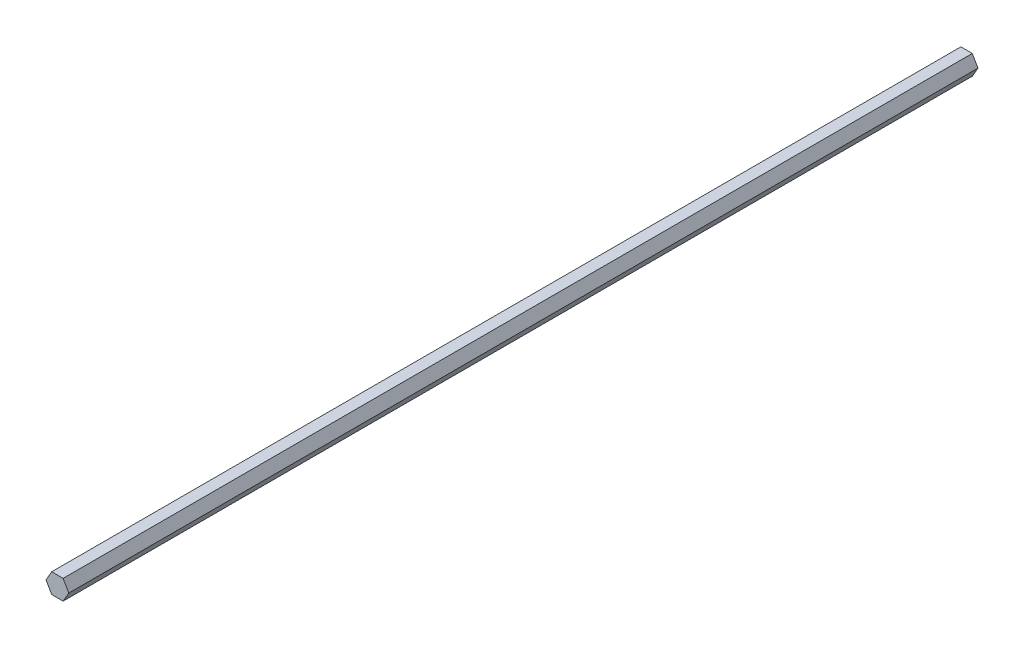
ISO-10303-21;
HEADER;
FILE_DESCRIPTION(('STEP AP214'),'2;1');
FILE_NAME('part.step','',(''),(''),'','','');
FILE_SCHEMA(('AUTOMOTIVE_DESIGN { 1 0 10303 214 1 1 1 1 }'));
ENDSEC;
DATA;
#1=APPLICATION_CONTEXT('core data for automotive mechanical design processes');
#2=APPLICATION_PROTOCOL_DEFINITION('international standard','automotive_design',2000,#1);
#3=PRODUCT_CONTEXT('',#1,'mechanical');
#4=PRODUCT('Part','Part','',(#3));
#5=PRODUCT_RELATED_PRODUCT_CATEGORY('part','',(#4));
#6=PRODUCT_DEFINITION_FORMATION('','',#4);
#7=PRODUCT_DEFINITION_CONTEXT('part definition',#1,'design');
#8=PRODUCT_DEFINITION('design','',#6,#7);
#9=PRODUCT_DEFINITION_SHAPE('','',#8);
#10=(LENGTH_UNIT() NAMED_UNIT(*) SI_UNIT(.MILLI.,.METRE.));
#11=(NAMED_UNIT(*) PLANE_ANGLE_UNIT() SI_UNIT($,.RADIAN.));
#12=(NAMED_UNIT(*) SI_UNIT($,.STERADIAN.) SOLID_ANGLE_UNIT());
#13=UNCERTAINTY_MEASURE_WITH_UNIT(LENGTH_MEASURE(1.E-05),#10,'distance_accuracy_value','');
#14=(GEOMETRIC_REPRESENTATION_CONTEXT(3) GLOBAL_UNCERTAINTY_ASSIGNED_CONTEXT((#13)) GLOBAL_UNIT_ASSIGNED_CONTEXT((#10,
#11,#12)) REPRESENTATION_CONTEXT('',''));
#15=CARTESIAN_POINT('',(0.,0.,0.));
#16=DIRECTION('',(0.,0.,1.));
#17=DIRECTION('',(1.,0.,0.));
#18=AXIS2_PLACEMENT_3D('',#15,#16,#17);
#19=CARTESIAN_POINT('',(3.66617420935419,-6.34999999999994,584.2));
#20=DIRECTION('',(-0.866025403784442,0.499999999999995,0.));
#21=DIRECTION('',(-0.499999999999995,-0.866025403784442,0.));
#22=AXIS2_PLACEMENT_3D('',#19,#20,#21);
#23=PLANE('',#22);
#24=DIRECTION('',(0.499999999999995,0.866025403784442,0.));
#25=VECTOR('',#24,1.);
#26=CARTESIAN_POINT('',(3.66617420935419,-6.34999999999994,0.));
#27=LINE('',#26,#25);
#28=CARTESIAN_POINT('',(3.66617420935419,-6.34999999999994,0.));
#29=VERTEX_POINT('',#28);
#30=CARTESIAN_POINT('',(7.33234841870822,0.,0.));
#31=VERTEX_POINT('',#30);
#32=EDGE_CURVE('E119',#29,#31,#27,.T.);
#33=ORIENTED_EDGE('',*,*,#32,.T.);
#34=DIRECTION('',(0.,0.,-1.));
#35=VECTOR('',#34,1.);
#36=CARTESIAN_POINT('',(7.33234841870822,0.,584.2));
#37=LINE('',#36,#35);
#38=CARTESIAN_POINT('',(7.33234841870822,0.,584.2));
#39=VERTEX_POINT('',#38);
#40=EDGE_CURVE('E11',#39,#31,#37,.T.);
#41=ORIENTED_EDGE('',*,*,#40,.F.);
#42=DIRECTION('',(0.499999999999995,0.866025403784442,0.));
#43=VECTOR('',#42,1.);
#44=CARTESIAN_POINT('',(3.66617420935419,-6.34999999999994,584.2));
#45=LINE('',#44,#43);
#46=CARTESIAN_POINT('',(3.66617420935419,-6.34999999999994,584.2));
#47=VERTEX_POINT('',#46);
#48=EDGE_CURVE('E129',#47,#39,#45,.T.);
#49=ORIENTED_EDGE('',*,*,#48,.F.);
#50=DIRECTION('',(0.,0.,-1.));
#51=VECTOR('',#50,1.);
#52=CARTESIAN_POINT('',(3.66617420935419,-6.34999999999994,584.2));
#53=LINE('',#52,#51);
#54=EDGE_CURVE('E115',#47,#29,#53,.T.);
#55=ORIENTED_EDGE('',*,*,#54,.T.);
#56=EDGE_LOOP('',(#33,#41,#49,#55));
#57=FACE_BOUND('',#56,.T.);
#58=ADVANCED_FACE('F35',(#57),#23,.F.);
#59=CARTESIAN_POINT('',(7.33234841870822,0.,584.2));
#60=DIRECTION('',(-0.866025403784438,-0.500000000000001,0.));
#61=DIRECTION('',(0.500000000000001,-0.866025403784438,0.));
#62=AXIS2_PLACEMENT_3D('',#59,#60,#61);
#63=PLANE('',#62);
#64=DIRECTION('',(-0.500000000000001,0.866025403784438,0.));
#65=VECTOR('',#64,1.);
#66=CARTESIAN_POINT('',(7.33234841870822,0.,0.));
#67=LINE('',#66,#65);
#68=CARTESIAN_POINT('',(3.6661742093541,6.34999999999999,0.));
#69=VERTEX_POINT('',#68);
#70=EDGE_CURVE('E122',#31,#69,#67,.T.);
#71=ORIENTED_EDGE('',*,*,#70,.T.);
#72=DIRECTION('',(0.,0.,-1.));
#73=VECTOR('',#72,1.);
#74=CARTESIAN_POINT('',(3.6661742093541,6.34999999999999,584.2));
#75=LINE('',#74,#73);
#76=CARTESIAN_POINT('',(3.6661742093541,6.34999999999999,584.2));
#77=VERTEX_POINT('',#76);
#78=EDGE_CURVE('E43',#77,#69,#75,.T.);
#79=ORIENTED_EDGE('',*,*,#78,.F.);
#80=DIRECTION('',(-0.500000000000001,0.866025403784438,0.));
#81=VECTOR('',#80,1.);
#82=CARTESIAN_POINT('',(7.33234841870822,0.,584.2));
#83=LINE('',#82,#81);
#84=EDGE_CURVE('E88',#39,#77,#83,.T.);
#85=ORIENTED_EDGE('',*,*,#84,.F.);
#86=ORIENTED_EDGE('',*,*,#40,.T.);
#87=EDGE_LOOP('',(#71,#79,#85,#86));
#88=FACE_BOUND('',#87,.T.);
#89=ADVANCED_FACE('F153',(#88),#63,.F.);
#90=CARTESIAN_POINT('',(3.6661742093541,6.34999999999999,584.2));
#91=DIRECTION('',(0.,-1.,0.));
#92=DIRECTION('',(1.,0.,0.));
#93=AXIS2_PLACEMENT_3D('',#90,#91,#92);
#94=PLANE('',#93);
#95=DIRECTION('',(-1.,0.,0.));
#96=VECTOR('',#95,1.);
#97=CARTESIAN_POINT('',(3.6661742093541,6.34999999999999,0.));
#98=LINE('',#97,#96);
#99=CARTESIAN_POINT('',(-3.66617420935414,6.34999999999996,0.));
#100=VERTEX_POINT('',#99);
#101=EDGE_CURVE('E124',#69,#100,#98,.T.);
#102=ORIENTED_EDGE('',*,*,#101,.T.);
#103=DIRECTION('',(0.,0.,-1.));
#104=VECTOR('',#103,1.);
#105=CARTESIAN_POINT('',(-3.66617420935414,6.34999999999996,584.2));
#106=LINE('',#105,#104);
#107=CARTESIAN_POINT('',(-3.66617420935414,6.34999999999996,584.2));
#108=VERTEX_POINT('',#107);
#109=EDGE_CURVE('E110',#108,#100,#106,.T.);
#110=ORIENTED_EDGE('',*,*,#109,.F.);
#111=DIRECTION('',(-1.,0.,0.));
#112=VECTOR('',#111,1.);
#113=CARTESIAN_POINT('',(3.6661742093541,6.34999999999999,584.2));
#114=LINE('',#113,#112);
#115=EDGE_CURVE('E101',#77,#108,#114,.T.);
#116=ORIENTED_EDGE('',*,*,#115,.F.);
#117=ORIENTED_EDGE('',*,*,#78,.T.);
#118=EDGE_LOOP('',(#102,#110,#116,#117));
#119=FACE_BOUND('',#118,.T.);
#120=ADVANCED_FACE('F135',(#119),#94,.F.);
#121=CARTESIAN_POINT('',(-3.66617420935414,6.34999999999996,584.2));
#122=DIRECTION('',(0.866025403784441,-0.499999999999995,0.));
#123=DIRECTION('',(0.499999999999995,0.866025403784442,0.));
#124=AXIS2_PLACEMENT_3D('',#121,#122,#123);
#125=PLANE('',#124);
#126=DIRECTION('',(-0.499999999999995,-0.866025403784442,0.));
#127=VECTOR('',#126,1.);
#128=CARTESIAN_POINT('',(-3.66617420935414,6.34999999999996,0.));
#129=LINE('',#128,#127);
#130=CARTESIAN_POINT('',(-7.33234841870822,0.,0.));
#131=VERTEX_POINT('',#130);
#132=EDGE_CURVE('E109',#100,#131,#129,.T.);
#133=ORIENTED_EDGE('',*,*,#132,.T.);
#134=DIRECTION('',(0.,0.,-1.));
#135=VECTOR('',#134,1.);
#136=CARTESIAN_POINT('',(-7.33234841870822,0.,584.2));
#137=LINE('',#136,#135);
#138=CARTESIAN_POINT('',(-7.33234841870822,0.,584.2));
#139=VERTEX_POINT('',#138);
#140=EDGE_CURVE('E106',#139,#131,#137,.T.);
#141=ORIENTED_EDGE('',*,*,#140,.F.);
#142=DIRECTION('',(-0.499999999999995,-0.866025403784442,0.));
#143=VECTOR('',#142,1.);
#144=CARTESIAN_POINT('',(-3.66617420935414,6.34999999999996,584.2));
#145=LINE('',#144,#143);
#146=EDGE_CURVE('E95',#108,#139,#145,.T.);
#147=ORIENTED_EDGE('',*,*,#146,.F.);
#148=ORIENTED_EDGE('',*,*,#109,.T.);
#149=EDGE_LOOP('',(#133,#141,#147,#148));
#150=FACE_BOUND('',#149,.T.);
#151=ADVANCED_FACE('F107',(#150),#125,.F.);
#152=CARTESIAN_POINT('',(-7.33234841870822,0.,584.2));
#153=DIRECTION('',(0.866025403784435,0.500000000000007,0.));
#154=DIRECTION('',(-0.500000000000007,0.866025403784435,0.));
#155=AXIS2_PLACEMENT_3D('',#152,#153,#154);
#156=PLANE('',#155);
#157=DIRECTION('',(0.500000000000007,-0.866025403784434,0.));
#158=VECTOR('',#157,1.);
#159=CARTESIAN_POINT('',(-7.33234841870822,0.,0.));
#160=LINE('',#159,#158);
#161=CARTESIAN_POINT('',(-3.66617420935405,-6.35000000000001,0.));
#162=VERTEX_POINT('',#161);
#163=EDGE_CURVE('E74',#131,#162,#160,.T.);
#164=ORIENTED_EDGE('',*,*,#163,.T.);
#165=DIRECTION('',(0.,0.,-1.));
#166=VECTOR('',#165,1.);
#167=CARTESIAN_POINT('',(-3.66617420935405,-6.35000000000001,584.2));
#168=LINE('',#167,#166);
#169=CARTESIAN_POINT('',(-3.66617420935405,-6.35000000000001,584.2));
#170=VERTEX_POINT('',#169);
#171=EDGE_CURVE('E111',#170,#162,#168,.T.);
#172=ORIENTED_EDGE('',*,*,#171,.F.);
#173=DIRECTION('',(0.500000000000007,-0.866025403784434,0.));
#174=VECTOR('',#173,1.);
#175=CARTESIAN_POINT('',(-7.33234841870822,0.,584.2));
#176=LINE('',#175,#174);
#177=EDGE_CURVE('E99',#139,#170,#176,.T.);
#178=ORIENTED_EDGE('',*,*,#177,.F.);
#179=ORIENTED_EDGE('',*,*,#140,.T.);
#180=EDGE_LOOP('',(#164,#172,#178,#179));
#181=FACE_BOUND('',#180,.T.);
#182=ADVANCED_FACE('F113',(#181),#156,.F.);
#183=CARTESIAN_POINT('',(-3.66617420935405,-6.35000000000001,584.2));
#184=DIRECTION('',(0.,1.,0.));
#185=DIRECTION('',(-1.,0.,0.));
#186=AXIS2_PLACEMENT_3D('',#183,#184,#185);
#187=PLANE('',#186);
#188=DIRECTION('',(1.,0.,0.));
#189=VECTOR('',#188,1.);
#190=CARTESIAN_POINT('',(-3.66617420935405,-6.35000000000001,0.));
#191=LINE('',#190,#189);
#192=EDGE_CURVE('E80',#162,#29,#191,.T.);
#193=ORIENTED_EDGE('',*,*,#192,.T.);
#194=ORIENTED_EDGE('',*,*,#54,.F.);
#195=DIRECTION('',(1.,0.,0.));
#196=VECTOR('',#195,1.);
#197=CARTESIAN_POINT('',(-3.66617420935405,-6.35000000000001,584.2));
#198=LINE('',#197,#196);
#199=EDGE_CURVE('E51',#170,#47,#198,.T.);
#200=ORIENTED_EDGE('',*,*,#199,.F.);
#201=ORIENTED_EDGE('',*,*,#171,.T.);
#202=EDGE_LOOP('',(#193,#194,#200,#201));
#203=FACE_BOUND('',#202,.T.);
#204=ADVANCED_FACE('F142',(#203),#187,.F.);
#205=CARTESIAN_POINT('',(0.,0.,584.2));
#206=DIRECTION('',(0.,0.,1.));
#207=DIRECTION('',(1.,0.,0.));
#208=AXIS2_PLACEMENT_3D('',#205,#206,#207);
#209=PLANE('',#208);
#210=ORIENTED_EDGE('',*,*,#48,.T.);
#211=ORIENTED_EDGE('',*,*,#84,.T.);
#212=ORIENTED_EDGE('',*,*,#115,.T.);
#213=ORIENTED_EDGE('',*,*,#146,.T.);
#214=ORIENTED_EDGE('',*,*,#177,.T.);
#215=ORIENTED_EDGE('',*,*,#199,.T.);
#216=EDGE_LOOP('',(#210,#211,#212,#213,#214,#215));
#217=FACE_BOUND('',#216,.T.);
#218=ADVANCED_FACE('F97',(#217),#209,.T.);
#219=CARTESIAN_POINT('',(0.,0.,0.));
#220=DIRECTION('',(0.,0.,1.));
#221=DIRECTION('',(1.,0.,0.));
#222=AXIS2_PLACEMENT_3D('',#219,#220,#221);
#223=PLANE('',#222);
#224=ORIENTED_EDGE('',*,*,#32,.F.);
#225=ORIENTED_EDGE('',*,*,#192,.F.);
#226=ORIENTED_EDGE('',*,*,#163,.F.);
#227=ORIENTED_EDGE('',*,*,#132,.F.);
#228=ORIENTED_EDGE('',*,*,#101,.F.);
#229=ORIENTED_EDGE('',*,*,#70,.F.);
#230=EDGE_LOOP('',(#224,#225,#226,#227,#228,#229));
#231=FACE_BOUND('',#230,.T.);
#232=ADVANCED_FACE('F138',(#231),#223,.F.);
#233=CLOSED_SHELL('',(#58,#89,#120,#151,#182,#204,#218,#232));
#234=MANIFOLD_SOLID_BREP('B2',#233);
#235=ADVANCED_BREP_SHAPE_REPRESENTATION('',(#18,#234),#14);
#236=SHAPE_DEFINITION_REPRESENTATION(#9,#235);
ENDSEC;
END-ISO-10303-21;
